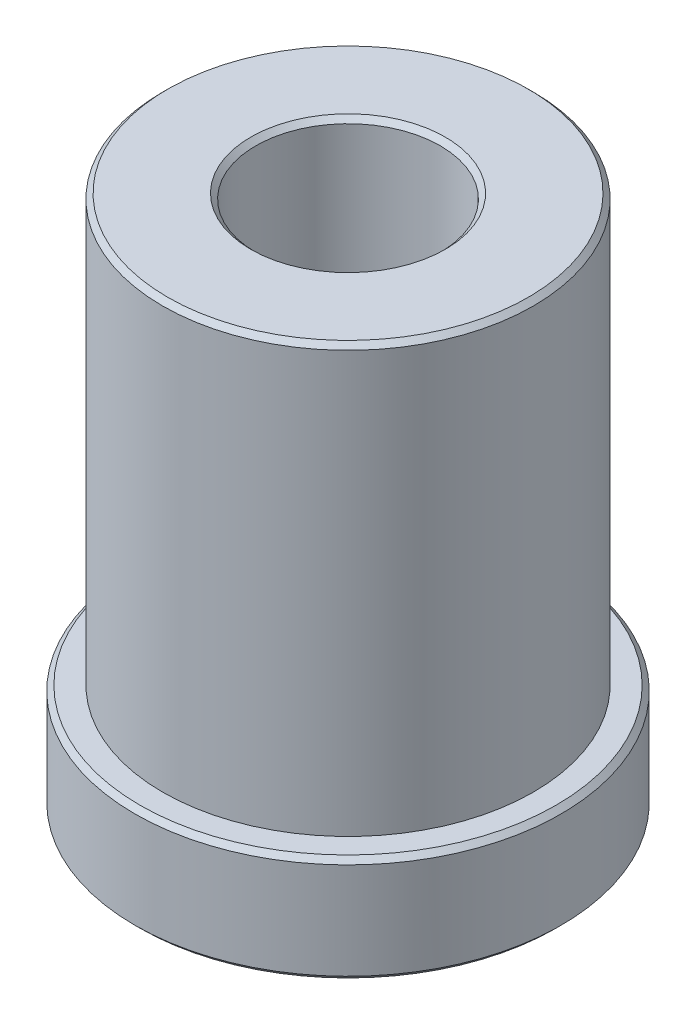
ISO-10303-21;
HEADER;
FILE_DESCRIPTION(('STEP AP214'),'2;1');
FILE_NAME('part.step','',(''),(''),'','','');
FILE_SCHEMA(('AUTOMOTIVE_DESIGN { 1 0 10303 214 1 1 1 1 }'));
ENDSEC;
DATA;
#1=APPLICATION_CONTEXT('core data for automotive mechanical design processes');
#2=APPLICATION_PROTOCOL_DEFINITION('international standard','automotive_design',2000,#1);
#3=PRODUCT_CONTEXT('',#1,'mechanical');
#4=PRODUCT('Part','Part','',(#3));
#5=PRODUCT_RELATED_PRODUCT_CATEGORY('part','',(#4));
#6=PRODUCT_DEFINITION_FORMATION('','',#4);
#7=PRODUCT_DEFINITION_CONTEXT('part definition',#1,'design');
#8=PRODUCT_DEFINITION('design','',#6,#7);
#9=PRODUCT_DEFINITION_SHAPE('','',#8);
#10=(LENGTH_UNIT() NAMED_UNIT(*) SI_UNIT(.MILLI.,.METRE.));
#11=(NAMED_UNIT(*) PLANE_ANGLE_UNIT() SI_UNIT($,.RADIAN.));
#12=(NAMED_UNIT(*) SI_UNIT($,.STERADIAN.) SOLID_ANGLE_UNIT());
#13=UNCERTAINTY_MEASURE_WITH_UNIT(LENGTH_MEASURE(1.E-05),#10,'distance_accuracy_value','');
#14=(GEOMETRIC_REPRESENTATION_CONTEXT(3) GLOBAL_UNCERTAINTY_ASSIGNED_CONTEXT((#13)) GLOBAL_UNIT_ASSIGNED_CONTEXT((#10,
#11,#12)) REPRESENTATION_CONTEXT('',''));
#15=CARTESIAN_POINT('',(0.,0.,0.));
#16=DIRECTION('',(0.,0.,1.));
#17=DIRECTION('',(1.,0.,0.));
#18=AXIS2_PLACEMENT_3D('',#15,#16,#17);
#19=CARTESIAN_POINT('',(0.,25.4,0.));
#20=DIRECTION('',(0.,-1.,0.));
#21=DIRECTION('',(0.,0.,-1.));
#22=AXIS2_PLACEMENT_3D('',#19,#20,#21);
#23=CYLINDRICAL_SURFACE('',#22,11.049);
#24=CARTESIAN_POINT('',(0.,25.100000092,0.));
#25=DIRECTION('',(0.,1.,0.));
#26=DIRECTION('',(0.,0.,1.));
#27=AXIS2_PLACEMENT_3D('',#24,#25,#26);
#28=CIRCLE('',#27,11.049);
#29=CARTESIAN_POINT('',(0.,25.100000092,11.049));
#30=VERTEX_POINT('',#29);
#31=EDGE_CURVE('E10',#30,#30,#28,.F.);
#32=ORIENTED_EDGE('',*,*,#31,.T.);
#33=EDGE_LOOP('',(#32));
#34=FACE_BOUND('',#33,.T.);
#35=CARTESIAN_POINT('',(0.,0.,0.));
#36=DIRECTION('',(0.,1.,0.));
#37=DIRECTION('',(0.,0.,1.));
#38=AXIS2_PLACEMENT_3D('',#35,#36,#37);
#39=CIRCLE('',#38,11.049);
#40=CARTESIAN_POINT('',(0.,0.,11.049));
#41=VERTEX_POINT('',#40);
#42=EDGE_CURVE('E86',#41,#41,#39,.T.);
#43=ORIENTED_EDGE('',*,*,#42,.T.);
#44=EDGE_LOOP('',(#43));
#45=FACE_BOUND('',#44,.T.);
#46=ADVANCED_FACE('F41',(#34,#45),#23,.T.);
#47=CARTESIAN_POINT('',(0.,25.4,0.));
#48=DIRECTION('',(0.,1.,0.));
#49=DIRECTION('',(0.,0.,1.));
#50=AXIS2_PLACEMENT_3D('',#47,#48,#49);
#51=PLANE('',#50);
#52=CARTESIAN_POINT('',(0.,25.4,0.));
#53=DIRECTION('',(0.,1.,0.));
#54=DIRECTION('',(0.,0.,1.));
#55=AXIS2_PLACEMENT_3D('',#52,#53,#54);
#56=CIRCLE('',#55,10.749000092);
#57=CARTESIAN_POINT('',(0.,25.4,10.749000092));
#58=VERTEX_POINT('',#57);
#59=EDGE_CURVE('E49',#58,#58,#56,.T.);
#60=ORIENTED_EDGE('',*,*,#59,.T.);
#61=EDGE_LOOP('',(#60));
#62=FACE_BOUND('',#61,.T.);
#63=CARTESIAN_POINT('',(0.,25.4,0.));
#64=DIRECTION('',(0.,1.,0.));
#65=DIRECTION('',(0.,0.,1.));
#66=AXIS2_PLACEMENT_3D('',#63,#64,#65);
#67=CIRCLE('',#66,5.79999995700001);
#68=CARTESIAN_POINT('',(0.,25.4,5.79999995700001));
#69=VERTEX_POINT('',#68);
#70=EDGE_CURVE('E53',#69,#69,#67,.F.);
#71=ORIENTED_EDGE('',*,*,#70,.T.);
#72=EDGE_LOOP('',(#71));
#73=FACE_BOUND('',#72,.T.);
#74=ADVANCED_FACE('F127',(#62,#73),#51,.T.);
#75=CARTESIAN_POINT('',(0.,-6.35,0.));
#76=DIRECTION('',(0.,1.,0.));
#77=DIRECTION('',(0.,0.,1.));
#78=AXIS2_PLACEMENT_3D('',#75,#76,#77);
#79=CYLINDRICAL_SURFACE('',#78,12.7);
#80=CARTESIAN_POINT('',(0.,-0.299999908,0.));
#81=DIRECTION('',(0.,-1.,0.));
#82=DIRECTION('',(0.,0.,-1.));
#83=AXIS2_PLACEMENT_3D('',#80,#81,#82);
#84=CIRCLE('',#83,12.7);
#85=CARTESIAN_POINT('',(0.,-0.299999908,-12.7));
#86=VERTEX_POINT('',#85);
#87=EDGE_CURVE('E71',#86,#86,#84,.T.);
#88=ORIENTED_EDGE('',*,*,#87,.T.);
#89=EDGE_LOOP('',(#88));
#90=FACE_BOUND('',#89,.T.);
#91=CARTESIAN_POINT('',(0.,-6.05000009199999,0.));
#92=DIRECTION('',(0.,-1.,0.));
#93=DIRECTION('',(0.,0.,-1.));
#94=AXIS2_PLACEMENT_3D('',#91,#92,#93);
#95=CIRCLE('',#94,12.7);
#96=CARTESIAN_POINT('',(0.,-6.05000009199999,12.7));
#97=VERTEX_POINT('',#96);
#98=EDGE_CURVE('E74',#97,#97,#95,.F.);
#99=ORIENTED_EDGE('',*,*,#98,.T.);
#100=EDGE_LOOP('',(#99));
#101=FACE_BOUND('',#100,.T.);
#102=ADVANCED_FACE('F132',(#90,#101),#79,.T.);
#103=CARTESIAN_POINT('',(0.,-6.35,0.));
#104=DIRECTION('',(0.,-1.,0.));
#105=DIRECTION('',(0.,0.,-1.));
#106=AXIS2_PLACEMENT_3D('',#103,#104,#105);
#107=PLANE('',#106);
#108=CARTESIAN_POINT('',(0.,-6.35,0.));
#109=DIRECTION('',(0.,-1.,0.));
#110=DIRECTION('',(0.,0.,-1.));
#111=AXIS2_PLACEMENT_3D('',#108,#109,#110);
#112=CIRCLE('',#111,12.400000092);
#113=CARTESIAN_POINT('',(0.,-6.35,12.400000092));
#114=VERTEX_POINT('',#113);
#115=EDGE_CURVE('E62',#114,#114,#112,.T.);
#116=ORIENTED_EDGE('',*,*,#115,.T.);
#117=EDGE_LOOP('',(#116));
#118=FACE_BOUND('',#117,.T.);
#119=CARTESIAN_POINT('',(0.,-6.35,0.));
#120=DIRECTION('',(0.,-1.,0.));
#121=DIRECTION('',(0.,0.,-1.));
#122=AXIS2_PLACEMENT_3D('',#119,#120,#121);
#123=CIRCLE('',#122,11.475999908);
#124=CARTESIAN_POINT('',(0.,-6.35,-11.475999908));
#125=VERTEX_POINT('',#124);
#126=EDGE_CURVE('E65',#125,#125,#123,.F.);
#127=ORIENTED_EDGE('',*,*,#126,.T.);
#128=EDGE_LOOP('',(#127));
#129=FACE_BOUND('',#128,.T.);
#130=ADVANCED_FACE('F122',(#118,#129),#107,.T.);
#131=CARTESIAN_POINT('',(0.,0.,0.));
#132=DIRECTION('',(0.,-1.,0.));
#133=DIRECTION('',(0.,0.,-1.));
#134=AXIS2_PLACEMENT_3D('',#131,#132,#133);
#135=PLANE('',#134);
#136=CARTESIAN_POINT('',(0.,0.,0.));
#137=DIRECTION('',(0.,-1.,0.));
#138=DIRECTION('',(0.,0.,-1.));
#139=AXIS2_PLACEMENT_3D('',#136,#137,#138);
#140=CIRCLE('',#139,12.400000092);
#141=CARTESIAN_POINT('',(0.,0.,-12.400000092));
#142=VERTEX_POINT('',#141);
#143=EDGE_CURVE('E68',#142,#142,#140,.F.);
#144=ORIENTED_EDGE('',*,*,#143,.T.);
#145=EDGE_LOOP('',(#144));
#146=FACE_BOUND('',#145,.T.);
#147=ORIENTED_EDGE('',*,*,#42,.F.);
#148=EDGE_LOOP('',(#147));
#149=FACE_BOUND('',#148,.T.);
#150=ADVANCED_FACE('F115',(#146,#149),#135,.F.);
#151=CARTESIAN_POINT('',(0.,-0.804672,0.));
#152=DIRECTION('',(0.,-1.,0.));
#153=DIRECTION('',(0.,0.,-1.));
#154=AXIS2_PLACEMENT_3D('',#151,#152,#153);
#155=CYLINDRICAL_SURFACE('',#154,11.176);
#156=CARTESIAN_POINT('',(0.,-6.05000009199995,0.));
#157=DIRECTION('',(0.,-1.,0.));
#158=DIRECTION('',(0.,0.,-1.));
#159=AXIS2_PLACEMENT_3D('',#156,#157,#158);
#160=CIRCLE('',#159,11.176);
#161=CARTESIAN_POINT('',(0.,-6.05000009199995,-11.176));
#162=VERTEX_POINT('',#161);
#163=EDGE_CURVE('E57',#162,#162,#160,.T.);
#164=CARTESIAN_POINT('',(0.,-0.804672,0.));
#165=DIRECTION('',(0.,-1.,0.));
#166=DIRECTION('',(0.,0.,-1.));
#167=AXIS2_PLACEMENT_3D('',#164,#165,#166);
#168=CIRCLE('',#167,11.176);
#169=CARTESIAN_POINT('',(0.,-0.804672,-11.176));
#170=VERTEX_POINT('',#169);
#171=EDGE_CURVE('E89',#170,#170,#168,.T.);
#172=CARTESIAN_POINT('',(0.,-6.05000009199995,-11.176));
#173=CARTESIAN_POINT('',(0.,-5.99536125770829,-11.176));
#174=CARTESIAN_POINT('',(0.,-5.94072242341662,-11.176));
#175=CARTESIAN_POINT('',(0.,-5.83144475483329,-11.176));
#176=CARTESIAN_POINT('',(0.,-5.77680592054162,-11.176));
#177=CARTESIAN_POINT('',(0.,-5.66752825195829,-11.176));
#178=CARTESIAN_POINT('',(0.,-5.61288941766662,-11.176));
#179=CARTESIAN_POINT('',(0.,-5.50361174908329,-11.176));
#180=CARTESIAN_POINT('',(0.,-5.44897291479163,-11.176));
#181=CARTESIAN_POINT('',(0.,-5.33969524620829,-11.176));
#182=CARTESIAN_POINT('',(0.,-5.28505641191663,-11.176));
#183=CARTESIAN_POINT('',(0.,-5.17577874333329,-11.176));
#184=CARTESIAN_POINT('',(0.,-5.12113990904163,-11.176));
#185=CARTESIAN_POINT('',(0.,-5.0118622404583,-11.176));
#186=CARTESIAN_POINT('',(0.,-4.95722340616663,-11.176));
#187=CARTESIAN_POINT('',(0.,-4.8479457375833,-11.176));
#188=CARTESIAN_POINT('',(0.,-4.79330690329163,-11.176));
#189=CARTESIAN_POINT('',(0.,-4.6840292347083,-11.176));
#190=CARTESIAN_POINT('',(0.,-4.62939040041663,-11.176));
#191=CARTESIAN_POINT('',(0.,-4.5201127318333,-11.176));
#192=CARTESIAN_POINT('',(0.,-4.46547389754164,-11.176));
#193=CARTESIAN_POINT('',(0.,-4.3561962289583,-11.176));
#194=CARTESIAN_POINT('',(0.,-4.30155739466664,-11.176));
#195=CARTESIAN_POINT('',(0.,-4.1922797260833,-11.176));
#196=CARTESIAN_POINT('',(0.,-4.13764089179164,-11.176));
#197=CARTESIAN_POINT('',(0.,-4.02836322320831,-11.176));
#198=CARTESIAN_POINT('',(0.,-3.97372438891664,-11.176));
#199=CARTESIAN_POINT('',(0.,-3.86444672033331,-11.176));
#200=CARTESIAN_POINT('',(0.,-3.80980788604164,-11.176));
#201=CARTESIAN_POINT('',(0.,-3.70053021745831,-11.176));
#202=CARTESIAN_POINT('',(0.,-3.64589138316664,-11.176));
#203=CARTESIAN_POINT('',(0.,-3.53661371458331,-11.176));
#204=CARTESIAN_POINT('',(0.,-3.48197488029164,-11.176));
#205=CARTESIAN_POINT('',(0.,-3.37269721170831,-11.176));
#206=CARTESIAN_POINT('',(0.,-3.31805837741664,-11.176));
#207=CARTESIAN_POINT('',(0.,-3.20878070883331,-11.176));
#208=CARTESIAN_POINT('',(0.,-3.15414187454165,-11.176));
#209=CARTESIAN_POINT('',(0.,-3.04486420595831,-11.176));
#210=CARTESIAN_POINT('',(0.,-2.99022537166665,-11.176));
#211=CARTESIAN_POINT('',(0.,-2.88094770308332,-11.176));
#212=CARTESIAN_POINT('',(0.,-2.82630886879165,-11.176));
#213=CARTESIAN_POINT('',(0.,-2.71703120020832,-11.176));
#214=CARTESIAN_POINT('',(0.,-2.66239236591665,-11.176));
#215=CARTESIAN_POINT('',(0.,-2.55311469733332,-11.176));
#216=CARTESIAN_POINT('',(0.,-2.49847586304165,-11.176));
#217=CARTESIAN_POINT('',(0.,-2.38919819445832,-11.176));
#218=CARTESIAN_POINT('',(0.,-2.33455936016665,-11.176));
#219=CARTESIAN_POINT('',(0.,-2.22528169158332,-11.176));
#220=CARTESIAN_POINT('',(0.,-2.17064285729165,-11.176));
#221=CARTESIAN_POINT('',(0.,-2.06136518870832,-11.176));
#222=CARTESIAN_POINT('',(0.,-2.00672635441666,-11.176));
#223=CARTESIAN_POINT('',(0.,-1.89744868583332,-11.176));
#224=CARTESIAN_POINT('',(0.,-1.84280985154166,-11.176));
#225=CARTESIAN_POINT('',(0.,-1.73353218295833,-11.176));
#226=CARTESIAN_POINT('',(0.,-1.67889334866666,-11.176));
#227=CARTESIAN_POINT('',(0.,-1.56961568008333,-11.176));
#228=CARTESIAN_POINT('',(0.,-1.51497684579166,-11.176));
#229=CARTESIAN_POINT('',(0.,-1.40569917720833,-11.176));
#230=CARTESIAN_POINT('',(0.,-1.35106034291666,-11.176));
#231=CARTESIAN_POINT('',(0.,-1.24178267433333,-11.176));
#232=CARTESIAN_POINT('',(0.,-1.18714384004166,-11.176));
#233=CARTESIAN_POINT('',(0.,-1.07786617145833,-11.176));
#234=CARTESIAN_POINT('',(0.,-1.02322733716667,-11.176));
#235=CARTESIAN_POINT('',(0.,-0.913949668583333,-11.176));
#236=CARTESIAN_POINT('',(0.,-0.859310834291666,-11.176));
#237=CARTESIAN_POINT('',(0.,-0.804672,-11.176));
#238=B_SPLINE_CURVE_WITH_KNOTS('',3,(#172,#173,#174,#175,#176,#177,#178,#179,#180,#181,#182,
#183,#184,#185,#186,#187,#188,#189,#190,#191,#192,#193,#194,#195,#196,#197,#198,#199,#200,#201,
#202,#203,#204,#205,#206,#207,#208,#209,#210,#211,#212,#213,#214,#215,#216,#217,#218,#219,#220,
#221,#222,#223,#224,#225,#226,#227,#228,#229,#230,#231,#232,#233,#234,#235,#236,#237),
.UNSPECIFIED.,.F.,.F.,(4,2,2,2,2,2,2,2,2,2,2,2,2,2,2,2,2,2,2,2,2,2,2,2,2,2,2,2,2,2,2,2,4),(0.,
0.163916502874999,0.327833005749997,0.491749508624996,0.655666011499995,0.819582514374993,
0.983499017249992,1.14741552012499,1.31133202299999,1.47524852587499,1.63916502874999,
1.80308153162498,1.96699803449998,2.13091453737498,2.29483104024998,2.45874754312498,
2.62266404599998,2.78658054887498,2.95049705174997,3.11441355462497,3.27833005749997,
3.44224656037497,3.60616306324997,3.77007956612497,3.93399606899996,4.09791257187496,
4.26182907474996,4.42574557762496,4.58966208049996,4.75357858337496,4.91749508624996,
5.08141158912496,5.24532809199995),.UNSPECIFIED.);
#239=EDGE_CURVE('BSEAM110',#162,#170,#238,.T.);
#240=ORIENTED_EDGE('',*,*,#163,.T.);
#241=ORIENTED_EDGE('',*,*,#171,.F.);
#242=ORIENTED_EDGE('',*,*,#239,.T.);
#243=ORIENTED_EDGE('',*,*,#239,.F.);
#244=EDGE_LOOP('',(#240,#242,#241,#243));
#245=FACE_BOUND('',#244,.T.);
#246=ADVANCED_FACE('F110',(#245),#155,.F.);
#247=CARTESIAN_POINT('',(0.,-0.804672,0.));
#248=DIRECTION('',(0.,-1.,0.));
#249=DIRECTION('',(0.,0.,-1.));
#250=AXIS2_PLACEMENT_3D('',#247,#248,#249);
#251=PLANE('',#250);
#252=CARTESIAN_POINT('',(0.,-0.804672,0.));
#253=DIRECTION('',(0.,-1.,0.));
#254=DIRECTION('',(0.,0.,-1.));
#255=AXIS2_PLACEMENT_3D('',#252,#253,#254);
#256=CIRCLE('',#255,7.27456);
#257=CARTESIAN_POINT('',(0.,-0.804672,-7.27456));
#258=VERTEX_POINT('',#257);
#259=EDGE_CURVE('E93',#258,#258,#256,.T.);
#260=ORIENTED_EDGE('',*,*,#259,.F.);
#261=EDGE_LOOP('',(#260));
#262=FACE_BOUND('',#261,.T.);
#263=ORIENTED_EDGE('',*,*,#171,.T.);
#264=EDGE_LOOP('',(#263));
#265=FACE_BOUND('',#264,.T.);
#266=ADVANCED_FACE('F104',(#262,#265),#251,.T.);
#267=CARTESIAN_POINT('',(0.,-0.6046724,0.));
#268=DIRECTION('',(0.,-1.,0.));
#269=DIRECTION('',(0.,0.,-1.));
#270=AXIS2_PLACEMENT_3D('',#267,#268,#269);
#271=CYLINDRICAL_SURFACE('',#270,7.27456);
#272=CARTESIAN_POINT('',(0.,-0.6046724,0.));
#273=DIRECTION('',(0.,-1.,0.));
#274=DIRECTION('',(0.,0.,-1.));
#275=AXIS2_PLACEMENT_3D('',#272,#273,#274);
#276=CIRCLE('',#275,7.27456);
#277=CARTESIAN_POINT('',(0.,-0.6046724,-7.27456));
#278=VERTEX_POINT('',#277);
#279=EDGE_CURVE('E92',#278,#278,#276,.T.);
#280=ORIENTED_EDGE('',*,*,#279,.F.);
#281=EDGE_LOOP('',(#280));
#282=FACE_BOUND('',#281,.T.);
#283=ORIENTED_EDGE('',*,*,#259,.T.);
#284=EDGE_LOOP('',(#283));
#285=FACE_BOUND('',#284,.T.);
#286=ADVANCED_FACE('F101',(#282,#285),#271,.F.);
#287=CARTESIAN_POINT('',(0.,-0.6046724,0.));
#288=DIRECTION('',(0.,-1.,0.));
#289=DIRECTION('',(0.,0.,-1.));
#290=AXIS2_PLACEMENT_3D('',#287,#288,#289);
#291=PLANE('',#290);
#292=CARTESIAN_POINT('',(0.,-0.6046724,0.));
#293=DIRECTION('',(0.,-1.,0.));
#294=DIRECTION('',(0.,0.,-1.));
#295=AXIS2_PLACEMENT_3D('',#292,#293,#294);
#296=CIRCLE('',#295,5.799999957);
#297=CARTESIAN_POINT('',(0.,-0.6046724,-5.799999957));
#298=VERTEX_POINT('',#297);
#299=EDGE_CURVE('E77',#298,#298,#296,.F.);
#300=ORIENTED_EDGE('',*,*,#299,.T.);
#301=EDGE_LOOP('',(#300));
#302=FACE_BOUND('',#301,.T.);
#303=ORIENTED_EDGE('',*,*,#279,.T.);
#304=EDGE_LOOP('',(#303));
#305=FACE_BOUND('',#304,.T.);
#306=ADVANCED_FACE('F99',(#302,#305),#291,.T.);
#307=CARTESIAN_POINT('',(0.,25.4,0.));
#308=DIRECTION('',(0.,-1.,0.));
#309=DIRECTION('',(0.,0.,-1.));
#310=AXIS2_PLACEMENT_3D('',#307,#308,#309);
#311=CYLINDRICAL_SURFACE('',#310,5.500000049);
#312=CARTESIAN_POINT('',(0.,-0.304672491999992,0.));
#313=DIRECTION('',(0.,-1.,0.));
#314=DIRECTION('',(0.,0.,-1.));
#315=AXIS2_PLACEMENT_3D('',#312,#313,#314);
#316=CIRCLE('',#315,5.500000049);
#317=CARTESIAN_POINT('',(0.,-0.304672491999988,-5.500000049));
#318=VERTEX_POINT('',#317);
#319=EDGE_CURVE('E80',#318,#318,#316,.T.);
#320=CARTESIAN_POINT('',(0.,25.100000092,0.));
#321=DIRECTION('',(0.,1.,0.));
#322=DIRECTION('',(0.,0.,1.));
#323=AXIS2_PLACEMENT_3D('',#320,#321,#322);
#324=CIRCLE('',#323,5.500000049);
#325=CARTESIAN_POINT('',(0.,25.100000092,-5.500000049));
#326=VERTEX_POINT('',#325);
#327=EDGE_CURVE('E83',#326,#326,#324,.T.);
#328=CARTESIAN_POINT('',(0.,-0.304672491999988,-5.500000049));
#329=CARTESIAN_POINT('',(0.,-0.0400404859166551,-5.500000049));
#330=CARTESIAN_POINT('',(0.,0.224591520166679,-5.500000049));
#331=CARTESIAN_POINT('',(0.,0.753855532333345,-5.500000049));
#332=CARTESIAN_POINT('',(0.,1.01848753841668,-5.500000049));
#333=CARTESIAN_POINT('',(0.,1.54775155058334,-5.500000049));
#334=CARTESIAN_POINT('',(0.,1.81238355666668,-5.500000049));
#335=CARTESIAN_POINT('',(0.,2.34164756883334,-5.500000049));
#336=CARTESIAN_POINT('',(0.,2.60627957491667,-5.500000049));
#337=CARTESIAN_POINT('',(0.,3.13554358708334,-5.500000049));
#338=CARTESIAN_POINT('',(0.,3.40017559316668,-5.500000049));
#339=CARTESIAN_POINT('',(0.,3.92943960533334,-5.500000049));
#340=CARTESIAN_POINT('',(0.,4.19407161141667,-5.500000049));
#341=CARTESIAN_POINT('',(0.,4.72333562358334,-5.500000049));
#342=CARTESIAN_POINT('',(0.,4.98796762966667,-5.500000049));
#343=CARTESIAN_POINT('',(0.,5.51723164183334,-5.500000049));
#344=CARTESIAN_POINT('',(0.,5.78186364791667,-5.500000049));
#345=CARTESIAN_POINT('',(0.,6.31112766008334,-5.500000049));
#346=CARTESIAN_POINT('',(0.,6.57575966616667,-5.500000049));
#347=CARTESIAN_POINT('',(0.,7.10502367833334,-5.500000049));
#348=CARTESIAN_POINT('',(0.,7.36965568441667,-5.500000049));
#349=CARTESIAN_POINT('',(0.,7.89891969658334,-5.500000049));
#350=CARTESIAN_POINT('',(0.,8.16355170266667,-5.500000049));
#351=CARTESIAN_POINT('',(0.,8.69281571483334,-5.500000049));
#352=CARTESIAN_POINT('',(0.,8.95744772091667,-5.500000049));
#353=CARTESIAN_POINT('',(0.,9.48671173308334,-5.500000049));
#354=CARTESIAN_POINT('',(0.,9.75134373916667,-5.500000049));
#355=CARTESIAN_POINT('',(0.,10.2806077513333,-5.500000049));
#356=CARTESIAN_POINT('',(0.,10.5452397574167,-5.500000049));
#357=CARTESIAN_POINT('',(0.,11.0745037695833,-5.500000049));
#358=CARTESIAN_POINT('',(0.,11.3391357756667,-5.500000049));
#359=CARTESIAN_POINT('',(0.,11.8683997878333,-5.500000049));
#360=CARTESIAN_POINT('',(0.,12.1330317939167,-5.500000049));
#361=CARTESIAN_POINT('',(0.,12.6622958060833,-5.500000049));
#362=CARTESIAN_POINT('',(0.,12.9269278121667,-5.500000049));
#363=CARTESIAN_POINT('',(0.,13.4561918243333,-5.500000049));
#364=CARTESIAN_POINT('',(0.,13.7208238304167,-5.500000049));
#365=CARTESIAN_POINT('',(0.,14.2500878425833,-5.500000049));
#366=CARTESIAN_POINT('',(0.,14.5147198486667,-5.500000049));
#367=CARTESIAN_POINT('',(0.,15.0439838608333,-5.500000049));
#368=CARTESIAN_POINT('',(0.,15.3086158669167,-5.500000049));
#369=CARTESIAN_POINT('',(0.,15.8378798790833,-5.500000049));
#370=CARTESIAN_POINT('',(0.,16.1025118851667,-5.500000049));
#371=CARTESIAN_POINT('',(0.,16.6317758973333,-5.500000049));
#372=CARTESIAN_POINT('',(0.,16.8964079034167,-5.500000049));
#373=CARTESIAN_POINT('',(0.,17.4256719155833,-5.500000049));
#374=CARTESIAN_POINT('',(0.,17.6903039216667,-5.500000049));
#375=CARTESIAN_POINT('',(0.,18.2195679338333,-5.500000049));
#376=CARTESIAN_POINT('',(0.,18.4841999399167,-5.500000049));
#377=CARTESIAN_POINT('',(0.,19.0134639520833,-5.500000049));
#378=CARTESIAN_POINT('',(0.,19.2780959581667,-5.500000049));
#379=CARTESIAN_POINT('',(0.,19.8073599703333,-5.500000049));
#380=CARTESIAN_POINT('',(0.,20.0719919764167,-5.500000049));
#381=CARTESIAN_POINT('',(0.,20.6012559885833,-5.500000049));
#382=CARTESIAN_POINT('',(0.,20.8658879946667,-5.500000049));
#383=CARTESIAN_POINT('',(0.,21.3951520068333,-5.500000049));
#384=CARTESIAN_POINT('',(0.,21.6597840129167,-5.500000049));
#385=CARTESIAN_POINT('',(0.,22.1890480250833,-5.500000049));
#386=CARTESIAN_POINT('',(0.,22.4536800311667,-5.500000049));
#387=CARTESIAN_POINT('',(0.,22.9829440433333,-5.500000049));
#388=CARTESIAN_POINT('',(0.,23.2475760494167,-5.500000049));
#389=CARTESIAN_POINT('',(0.,23.7768400615833,-5.500000049));
#390=CARTESIAN_POINT('',(0.,24.0414720676667,-5.500000049));
#391=CARTESIAN_POINT('',(0.,24.5707360798333,-5.500000049));
#392=CARTESIAN_POINT('',(0.,24.8353680859167,-5.500000049));
#393=CARTESIAN_POINT('',(0.,25.100000092,-5.500000049));
#394=B_SPLINE_CURVE_WITH_KNOTS('',3,(#328,#329,#330,#331,#332,#333,#334,#335,#336,#337,#338,
#339,#340,#341,#342,#343,#344,#345,#346,#347,#348,#349,#350,#351,#352,#353,#354,#355,#356,#357,
#358,#359,#360,#361,#362,#363,#364,#365,#366,#367,#368,#369,#370,#371,#372,#373,#374,#375,#376,
#377,#378,#379,#380,#381,#382,#383,#384,#385,#386,#387,#388,#389,#390,#391,#392,#393),
.UNSPECIFIED.,.F.,.F.,(4,2,2,2,2,2,2,2,2,2,2,2,2,2,2,2,2,2,2,2,2,2,2,2,2,2,2,2,2,2,2,2,4),(0.,
0.793896018250001,1.5877920365,2.38168805475,3.175584073,3.96948009125,4.7633761095,
5.55727212774999,6.35116814599999,7.14506416425,7.93896018249999,8.73285620074999,
9.52675221899999,10.32064823725,11.1145442555,11.90844027375,12.702336292,13.49623231025,
14.2901283285,15.08402434675,15.877920365,16.67181638325,17.4657124015,18.25960841975,
19.053504438,19.84740045625,20.6412964745,21.43519249275,22.229088511,23.02298452925,
23.8168805475,24.61077656575,25.404672584),.UNSPECIFIED.);
#395=EDGE_CURVE('BSEAM145',#318,#326,#394,.T.);
#396=ORIENTED_EDGE('',*,*,#319,.T.);
#397=ORIENTED_EDGE('',*,*,#327,.T.);
#398=ORIENTED_EDGE('',*,*,#395,.T.);
#399=ORIENTED_EDGE('',*,*,#395,.F.);
#400=EDGE_LOOP('',(#396,#398,#397,#399));
#401=FACE_BOUND('',#400,.T.);
#402=ADVANCED_FACE('F145',(#401),#311,.F.);
#403=CARTESIAN_POINT('',(0.,-0.304672491999992,0.));
#404=DIRECTION('',(0.,-1.,0.));
#405=DIRECTION('',(0.,0.,-1.));
#406=AXIS2_PLACEMENT_3D('',#403,#404,#405);
#407=CONICAL_SURFACE('',#406,5.500000049,0.785398163397437);
#408=CARTESIAN_POINT('',(0.,-0.6046724,-5.799999957));
#409=CARTESIAN_POINT('',(0.,-0.601547400958333,-5.79687495795834));
#410=CARTESIAN_POINT('',(0.,-0.598422401916667,-5.79374995891667));
#411=CARTESIAN_POINT('',(0.,-0.592172403833333,-5.78749996083334));
#412=CARTESIAN_POINT('',(0.,-0.589047404791666,-5.78437496179167));
#413=CARTESIAN_POINT('',(0.,-0.582797406708333,-5.77812496370834));
#414=CARTESIAN_POINT('',(0.,-0.579672407666666,-5.77499996466667));
#415=CARTESIAN_POINT('',(0.,-0.573422409583333,-5.76874996658333));
#416=CARTESIAN_POINT('',(0.,-0.570297410541666,-5.76562496754167));
#417=CARTESIAN_POINT('',(0.,-0.564047412458332,-5.75937496945834));
#418=CARTESIAN_POINT('',(0.,-0.560922413416665,-5.75624997041667));
#419=CARTESIAN_POINT('',(0.,-0.554672415333332,-5.74999997233333));
#420=CARTESIAN_POINT('',(0.,-0.551547416291665,-5.74687497329167));
#421=CARTESIAN_POINT('',(0.,-0.545297418208332,-5.74062497520833));
#422=CARTESIAN_POINT('',(0.,-0.542172419166665,-5.73749997616667));
#423=CARTESIAN_POINT('',(0.,-0.535922421083332,-5.73124997808333));
#424=CARTESIAN_POINT('',(0.,-0.532797422041665,-5.72812497904167));
#425=CARTESIAN_POINT('',(0.,-0.526547423958331,-5.72187498095833));
#426=CARTESIAN_POINT('',(0.,-0.523422424916665,-5.71874998191667));
#427=CARTESIAN_POINT('',(0.,-0.517172426833331,-5.71249998383333));
#428=CARTESIAN_POINT('',(0.,-0.514047427791664,-5.70937498479167));
#429=CARTESIAN_POINT('',(0.,-0.507797429708331,-5.70312498670833));
#430=CARTESIAN_POINT('',(0.,-0.504672430666664,-5.69999998766667));
#431=CARTESIAN_POINT('',(0.,-0.498422432583331,-5.69374998958333));
#432=CARTESIAN_POINT('',(0.,-0.495297433541664,-5.69062499054167));
#433=CARTESIAN_POINT('',(0.,-0.48904743545833,-5.68437499245833));
#434=CARTESIAN_POINT('',(0.,-0.485922436416664,-5.68124999341667));
#435=CARTESIAN_POINT('',(0.,-0.47967243833333,-5.67499999533333));
#436=CARTESIAN_POINT('',(0.,-0.476547439291663,-5.67187499629167));
#437=CARTESIAN_POINT('',(0.,-0.47029744120833,-5.66562499820833));
#438=CARTESIAN_POINT('',(0.,-0.467172442166663,-5.66249999916667));
#439=CARTESIAN_POINT('',(0.,-0.460922444083329,-5.65625000108333));
#440=CARTESIAN_POINT('',(0.,-0.457797445041663,-5.65312500204167));
#441=CARTESIAN_POINT('',(0.,-0.451547446958329,-5.64687500395833));
#442=CARTESIAN_POINT('',(0.,-0.448422447916662,-5.64375000491667));
#443=CARTESIAN_POINT('',(0.,-0.442172449833329,-5.63750000683333));
#444=CARTESIAN_POINT('',(0.,-0.439047450791662,-5.63437500779167));
#445=CARTESIAN_POINT('',(0.,-0.432797452708329,-5.62812500970833));
#446=CARTESIAN_POINT('',(0.,-0.429672453666662,-5.62500001066667));
#447=CARTESIAN_POINT('',(0.,-0.423422455583328,-5.61875001258333));
#448=CARTESIAN_POINT('',(0.,-0.420297456541662,-5.61562501354167));
#449=CARTESIAN_POINT('',(0.,-0.414047458458328,-5.60937501545833));
#450=CARTESIAN_POINT('',(0.,-0.410922459416661,-5.60625001641667));
#451=CARTESIAN_POINT('',(0.,-0.404672461333328,-5.60000001833333));
#452=CARTESIAN_POINT('',(0.,-0.401547462291661,-5.59687501929167));
#453=CARTESIAN_POINT('',(0.,-0.395297464208328,-5.59062502120833));
#454=CARTESIAN_POINT('',(0.,-0.392172465166661,-5.58750002216667));
#455=CARTESIAN_POINT('',(0.,-0.385922467083327,-5.58125002408333));
#456=CARTESIAN_POINT('',(0.,-0.382797468041661,-5.57812502504167));
#457=CARTESIAN_POINT('',(0.,-0.376547469958327,-5.57187502695833));
#458=CARTESIAN_POINT('',(0.,-0.37342247091666,-5.56875002791667));
#459=CARTESIAN_POINT('',(0.,-0.367172472833327,-5.56250002983333));
#460=CARTESIAN_POINT('',(0.,-0.36404747379166,-5.55937503079167));
#461=CARTESIAN_POINT('',(0.,-0.357797475708326,-5.55312503270833));
#462=CARTESIAN_POINT('',(0.,-0.35467247666666,-5.55000003366667));
#463=CARTESIAN_POINT('',(0.,-0.348422478583326,-5.54375003558333));
#464=CARTESIAN_POINT('',(0.,-0.34529747954166,-5.54062503654167));
#465=CARTESIAN_POINT('',(0.,-0.339047481458326,-5.53437503845833));
#466=CARTESIAN_POINT('',(0.,-0.335922482416659,-5.53125003941667));
#467=CARTESIAN_POINT('',(0.,-0.329672484333326,-5.52500004133333));
#468=CARTESIAN_POINT('',(0.,-0.326547485291659,-5.52187504229167));
#469=CARTESIAN_POINT('',(0.,-0.320297487208326,-5.51562504420833));
#470=CARTESIAN_POINT('',(0.,-0.317172488166659,-5.51250004516667));
#471=CARTESIAN_POINT('',(0.,-0.310922490083325,-5.50625004708333));
#472=CARTESIAN_POINT('',(0.,-0.307797491041658,-5.50312504804167));
#473=CARTESIAN_POINT('',(0.,-0.304672491999992,-5.500000049));
#474=B_SPLINE_CURVE_WITH_KNOTS('',3,(#408,#409,#410,#411,#412,#413,#414,#415,#416,#417,#418,
#419,#420,#421,#422,#423,#424,#425,#426,#427,#428,#429,#430,#431,#432,#433,#434,#435,#436,#437,
#438,#439,#440,#441,#442,#443,#444,#445,#446,#447,#448,#449,#450,#451,#452,#453,#454,#455,#456,
#457,#458,#459,#460,#461,#462,#463,#464,#465,#466,#467,#468,#469,#470,#471,#472,#473),
.UNSPECIFIED.,.F.,.F.,(4,2,2,2,2,2,2,2,2,2,2,2,2,2,2,2,2,2,2,2,2,2,2,2,2,2,2,2,2,2,2,2,4),(0.,
0.0132582480813841,0.0265164961627682,0.0397747442441521,0.0530329923255362,0.0662912404069203,
0.0795494884883043,0.0928077365696884,0.106065984651072,0.119324232732456,0.13258248081384,
0.145840728895224,0.159098976976609,0.172357225057993,0.185615473139376,0.19887372122076,
0.212131969302144,0.225390217383528,0.238648465464912,0.251906713546296,0.26516496162768,
0.278423209709064,0.291681457790448,0.304939705871832,0.318197953953216,0.3314562020346,
0.344714450115984,0.357972698197368,0.371230946278752,0.384489194360136,0.39774744244152,
0.411005690522904,0.424263938604288),.UNSPECIFIED.);
#475=EDGE_CURVE('BSEAM138',#298,#318,#474,.T.);
#476=ORIENTED_EDGE('',*,*,#299,.F.);
#477=ORIENTED_EDGE('',*,*,#319,.F.);
#478=ORIENTED_EDGE('',*,*,#475,.T.);
#479=ORIENTED_EDGE('',*,*,#475,.F.);
#480=EDGE_LOOP('',(#476,#478,#477,#479));
#481=FACE_BOUND('',#480,.T.);
#482=ADVANCED_FACE('F138',(#481),#407,.F.);
#483=CARTESIAN_POINT('',(0.,-0.299999908,0.));
#484=DIRECTION('',(0.,-1.,0.));
#485=DIRECTION('',(0.,0.,-1.));
#486=AXIS2_PLACEMENT_3D('',#483,#484,#485);
#487=CONICAL_SURFACE('',#486,12.7,0.785398163397445);
#488=ORIENTED_EDGE('',*,*,#143,.F.);
#489=EDGE_LOOP('',(#488));
#490=FACE_BOUND('',#489,.T.);
#491=ORIENTED_EDGE('',*,*,#87,.F.);
#492=EDGE_LOOP('',(#491));
#493=FACE_BOUND('',#492,.T.);
#494=ADVANCED_FACE('F144',(#490,#493),#487,.T.);
#495=CARTESIAN_POINT('',(0.,-6.35,0.));
#496=DIRECTION('',(0.,1.,0.));
#497=DIRECTION('',(0.,0.,1.));
#498=AXIS2_PLACEMENT_3D('',#495,#496,#497);
#499=CONICAL_SURFACE('',#498,12.400000092,0.78539816339744);
#500=CARTESIAN_POINT('',(0.,-6.05000009199999,12.7));
#501=CARTESIAN_POINT('',(0.,-6.05312509104166,12.6968750009583));
#502=CARTESIAN_POINT('',(0.,-6.05625009008333,12.6937500019167));
#503=CARTESIAN_POINT('',(0.,-6.06250008816666,12.6875000038333));
#504=CARTESIAN_POINT('',(0.,-6.06562508720833,12.6843750047917));
#505=CARTESIAN_POINT('',(0.,-6.07187508529166,12.6781250067083));
#506=CARTESIAN_POINT('',(0.,-6.07500008433333,12.6750000076667));
#507=CARTESIAN_POINT('',(0.,-6.08125008241666,12.6687500095833));
#508=CARTESIAN_POINT('',(0.,-6.08437508145833,12.6656250105417));
#509=CARTESIAN_POINT('',(0.,-6.09062507954166,12.6593750124583));
#510=CARTESIAN_POINT('',(0.,-6.09375007858333,12.6562500134167));
#511=CARTESIAN_POINT('',(0.,-6.10000007666666,12.6500000153333));
#512=CARTESIAN_POINT('',(0.,-6.10312507570833,12.6468750162917));
#513=CARTESIAN_POINT('',(0.,-6.10937507379166,12.6406250182083));
#514=CARTESIAN_POINT('',(0.,-6.11250007283333,12.6375000191667));
#515=CARTESIAN_POINT('',(0.,-6.11875007091666,12.6312500210833));
#516=CARTESIAN_POINT('',(0.,-6.12187506995833,12.6281250220417));
#517=CARTESIAN_POINT('',(0.,-6.12812506804166,12.6218750239583));
#518=CARTESIAN_POINT('',(0.,-6.13125006708333,12.6187500249167));
#519=CARTESIAN_POINT('',(0.,-6.13750006516666,12.6125000268333));
#520=CARTESIAN_POINT('',(0.,-6.14062506420833,12.6093750277917));
#521=CARTESIAN_POINT('',(0.,-6.14687506229166,12.6031250297083));
#522=CARTESIAN_POINT('',(0.,-6.15000006133333,12.6000000306667));
#523=CARTESIAN_POINT('',(0.,-6.15625005941666,12.5937500325833));
#524=CARTESIAN_POINT('',(0.,-6.15937505845833,12.5906250335417));
#525=CARTESIAN_POINT('',(0.,-6.16562505654166,12.5843750354583));
#526=CARTESIAN_POINT('',(0.,-6.16875005558333,12.5812500364167));
#527=CARTESIAN_POINT('',(0.,-6.17500005366666,12.5750000383333));
#528=CARTESIAN_POINT('',(0.,-6.17812505270833,12.5718750392917));
#529=CARTESIAN_POINT('',(0.,-6.18437505079166,12.5656250412083));
#530=CARTESIAN_POINT('',(0.,-6.18750004983333,12.5625000421667));
#531=CARTESIAN_POINT('',(0.,-6.19375004791666,12.5562500440833));
#532=CARTESIAN_POINT('',(0.,-6.19687504695833,12.5531250450417));
#533=CARTESIAN_POINT('',(0.,-6.20312504504166,12.5468750469583));
#534=CARTESIAN_POINT('',(0.,-6.20625004408333,12.5437500479167));
#535=CARTESIAN_POINT('',(0.,-6.21250004216666,12.5375000498333));
#536=CARTESIAN_POINT('',(0.,-6.21562504120833,12.5343750507917));
#537=CARTESIAN_POINT('',(0.,-6.22187503929166,12.5281250527083));
#538=CARTESIAN_POINT('',(0.,-6.22500003833333,12.5250000536667));
#539=CARTESIAN_POINT('',(0.,-6.23125003641666,12.5187500555833));
#540=CARTESIAN_POINT('',(0.,-6.23437503545833,12.5156250565417));
#541=CARTESIAN_POINT('',(0.,-6.24062503354166,12.5093750584583));
#542=CARTESIAN_POINT('',(0.,-6.24375003258333,12.5062500594167));
#543=CARTESIAN_POINT('',(0.,-6.25000003066666,12.5000000613333));
#544=CARTESIAN_POINT('',(0.,-6.25312502970833,12.4968750622917));
#545=CARTESIAN_POINT('',(0.,-6.25937502779166,12.4906250642083));
#546=CARTESIAN_POINT('',(0.,-6.26250002683333,12.4875000651667));
#547=CARTESIAN_POINT('',(0.,-6.26875002491666,12.4812500670833));
#548=CARTESIAN_POINT('',(0.,-6.27187502395833,12.4781250680417));
#549=CARTESIAN_POINT('',(0.,-6.27812502204166,12.4718750699583));
#550=CARTESIAN_POINT('',(0.,-6.28125002108333,12.4687500709167));
#551=CARTESIAN_POINT('',(0.,-6.28750001916666,12.4625000728333));
#552=CARTESIAN_POINT('',(0.,-6.29062501820833,12.4593750737917));
#553=CARTESIAN_POINT('',(0.,-6.29687501629166,12.4531250757083));
#554=CARTESIAN_POINT('',(0.,-6.30000001533333,12.4500000766667));
#555=CARTESIAN_POINT('',(0.,-6.30625001341666,12.4437500785833));
#556=CARTESIAN_POINT('',(0.,-6.30937501245833,12.4406250795417));
#557=CARTESIAN_POINT('',(0.,-6.31562501054167,12.4343750814583));
#558=CARTESIAN_POINT('',(0.,-6.31875000958333,12.4312500824167));
#559=CARTESIAN_POINT('',(0.,-6.32500000766666,12.4250000843333));
#560=CARTESIAN_POINT('',(0.,-6.32812500670833,12.4218750852917));
#561=CARTESIAN_POINT('',(0.,-6.33437500479167,12.4156250872083));
#562=CARTESIAN_POINT('',(0.,-6.33750000383333,12.4125000881667));
#563=CARTESIAN_POINT('',(0.,-6.34375000191667,12.4062500900833));
#564=CARTESIAN_POINT('',(0.,-6.34687500095833,12.4031250910417));
#565=CARTESIAN_POINT('',(0.,-6.35,12.400000092));
#566=B_SPLINE_CURVE_WITH_KNOTS('',3,(#500,#501,#502,#503,#504,#505,#506,#507,#508,#509,#510,
#511,#512,#513,#514,#515,#516,#517,#518,#519,#520,#521,#522,#523,#524,#525,#526,#527,#528,#529,
#530,#531,#532,#533,#534,#535,#536,#537,#538,#539,#540,#541,#542,#543,#544,#545,#546,#547,#548,
#549,#550,#551,#552,#553,#554,#555,#556,#557,#558,#559,#560,#561,#562,#563,#564,#565),
.UNSPECIFIED.,.F.,.F.,(4,2,2,2,2,2,2,2,2,2,2,2,2,2,2,2,2,2,2,2,2,2,2,2,2,2,2,2,2,2,2,2,4),(0.,
0.0132582480813846,0.0265164961627685,0.0397747442441524,0.0530329923255364,0.0662912404069203,
0.0795494884883043,0.0928077365696882,0.106065984651071,0.119324232732455,0.132582480813839,
0.145840728895223,0.159098976976607,0.172357225057991,0.185615473139375,0.198873721220759,
0.212131969302143,0.225390217383527,0.238648465464911,0.251906713546295,0.265164961627679,
0.278423209709063,0.291681457790447,0.304939705871831,0.318197953953215,0.3314562020346,
0.344714450115984,0.357972698197367,0.371230946278751,0.384489194360135,0.397747442441519,
0.411005690522903,0.424263938604288),.UNSPECIFIED.);
#567=EDGE_CURVE('BSEAM152',#97,#114,#566,.T.);
#568=ORIENTED_EDGE('',*,*,#98,.F.);
#569=ORIENTED_EDGE('',*,*,#115,.F.);
#570=ORIENTED_EDGE('',*,*,#567,.T.);
#571=ORIENTED_EDGE('',*,*,#567,.F.);
#572=EDGE_LOOP('',(#568,#570,#569,#571));
#573=FACE_BOUND('',#572,.T.);
#574=ADVANCED_FACE('F152',(#573),#499,.T.);
#575=CARTESIAN_POINT('',(0.,-6.05000009199995,0.));
#576=DIRECTION('',(0.,-1.,0.));
#577=DIRECTION('',(0.,0.,-1.));
#578=AXIS2_PLACEMENT_3D('',#575,#576,#577);
#579=CONICAL_SURFACE('',#578,11.176,0.78539816339744);
#580=ORIENTED_EDGE('',*,*,#126,.F.);
#581=EDGE_LOOP('',(#580));
#582=FACE_BOUND('',#581,.T.);
#583=ORIENTED_EDGE('',*,*,#163,.F.);
#584=EDGE_LOOP('',(#583));
#585=FACE_BOUND('',#584,.T.);
#586=ADVANCED_FACE('F159',(#582,#585),#579,.F.);
#587=CARTESIAN_POINT('',(0.,25.4,0.));
#588=DIRECTION('',(0.,-1.,0.));
#589=DIRECTION('',(0.,0.,-1.));
#590=AXIS2_PLACEMENT_3D('',#587,#588,#589);
#591=CONICAL_SURFACE('',#590,10.749000092,0.785398163397431);
#592=ORIENTED_EDGE('',*,*,#31,.F.);
#593=EDGE_LOOP('',(#592));
#594=FACE_BOUND('',#593,.T.);
#595=ORIENTED_EDGE('',*,*,#59,.F.);
#596=EDGE_LOOP('',(#595));
#597=FACE_BOUND('',#596,.T.);
#598=ADVANCED_FACE('F165',(#594,#597),#591,.T.);
#599=CARTESIAN_POINT('',(0.,25.4,0.));
#600=DIRECTION('',(0.,1.,0.));
#601=DIRECTION('',(0.,0.,1.));
#602=AXIS2_PLACEMENT_3D('',#599,#600,#601);
#603=CONICAL_SURFACE('',#602,5.79999995700001,0.785398163397448);
#604=ORIENTED_EDGE('',*,*,#327,.F.);
#605=EDGE_LOOP('',(#604));
#606=FACE_BOUND('',#605,.T.);
#607=ORIENTED_EDGE('',*,*,#70,.F.);
#608=EDGE_LOOP('',(#607));
#609=FACE_BOUND('',#608,.T.);
#610=ADVANCED_FACE('F44',(#606,#609),#603,.F.);
#611=CLOSED_SHELL('',(#46,#74,#102,#130,#150,#246,#266,#286,#306,#402,#482,#494,#574,#586,#598,#610));
#612=MANIFOLD_SOLID_BREP('B2',#611);
#613=ADVANCED_BREP_SHAPE_REPRESENTATION('',(#18,#612),#14);
#614=SHAPE_DEFINITION_REPRESENTATION(#9,#613);
ENDSEC;
END-ISO-10303-21;
